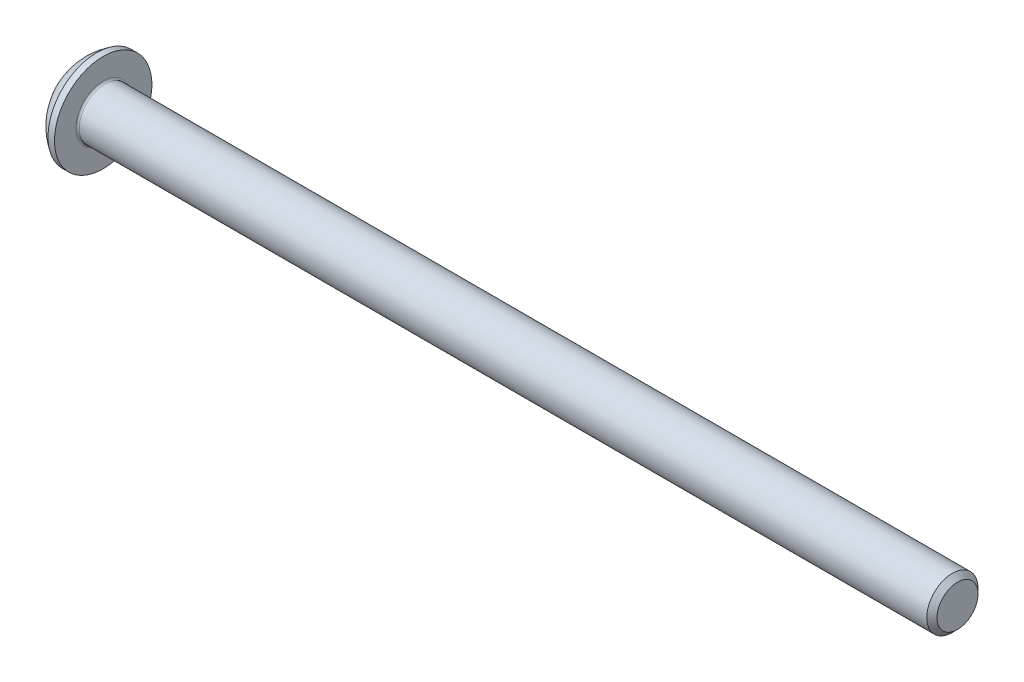
ISO-10303-21;
HEADER;
FILE_DESCRIPTION(('STEP AP214'),'2;1');
FILE_NAME('part.step','',(''),(''),'','','');
FILE_SCHEMA(('AUTOMOTIVE_DESIGN { 1 0 10303 214 1 1 1 1 }'));
ENDSEC;
DATA;
#1=APPLICATION_CONTEXT('core data for automotive mechanical design processes');
#2=APPLICATION_PROTOCOL_DEFINITION('international standard','automotive_design',2000,#1);
#3=PRODUCT_CONTEXT('',#1,'mechanical');
#4=PRODUCT('Part','Part','',(#3));
#5=PRODUCT_RELATED_PRODUCT_CATEGORY('part','',(#4));
#6=PRODUCT_DEFINITION_FORMATION('','',#4);
#7=PRODUCT_DEFINITION_CONTEXT('part definition',#1,'design');
#8=PRODUCT_DEFINITION('design','',#6,#7);
#9=PRODUCT_DEFINITION_SHAPE('','',#8);
#10=(LENGTH_UNIT() NAMED_UNIT(*) SI_UNIT(.MILLI.,.METRE.));
#11=(NAMED_UNIT(*) PLANE_ANGLE_UNIT() SI_UNIT($,.RADIAN.));
#12=(NAMED_UNIT(*) SI_UNIT($,.STERADIAN.) SOLID_ANGLE_UNIT());
#13=UNCERTAINTY_MEASURE_WITH_UNIT(LENGTH_MEASURE(1.E-05),#10,'distance_accuracy_value','');
#14=(GEOMETRIC_REPRESENTATION_CONTEXT(3) GLOBAL_UNCERTAINTY_ASSIGNED_CONTEXT((#13)) GLOBAL_UNIT_ASSIGNED_CONTEXT((#10,
#11,#12)) REPRESENTATION_CONTEXT('',''));
#15=CARTESIAN_POINT('',(0.,0.,0.));
#16=DIRECTION('',(0.,0.,1.));
#17=DIRECTION('',(1.,0.,0.));
#18=AXIS2_PLACEMENT_3D('',#15,#16,#17);
#19=CARTESIAN_POINT('',(0.,0.,0.));
#20=DIRECTION('',(-1.,0.,0.));
#21=DIRECTION('',(0.,0.,1.));
#22=AXIS2_PLACEMENT_3D('',#19,#20,#21);
#23=PLANE('',#22);
#24=CARTESIAN_POINT('',(0.,0.,0.));
#25=DIRECTION('',(-1.,0.,0.));
#26=DIRECTION('',(0.,0.,1.));
#27=AXIS2_PLACEMENT_3D('',#24,#25,#26);
#28=CIRCLE('',#27,1.425);
#29=CARTESIAN_POINT('',(0.,1.42499999999992,0.));
#30=VERTEX_POINT('',#29);
#31=EDGE_CURVE('E163',#30,#30,#28,.T.);
#32=ORIENTED_EDGE('',*,*,#31,.T.);
#33=EDGE_LOOP('',(#32));
#34=FACE_BOUND('',#33,.T.);
#35=DIRECTION('',(0.,-1.,0.));
#36=VECTOR('',#35,1.);
#37=CARTESIAN_POINT('',(-2.22044604925031E-13,-0.577350269189647,1.));
#38=LINE('',#37,#36);
#39=CARTESIAN_POINT('',(0.,0.577350269189647,1.));
#40=VERTEX_POINT('',#39);
#41=CARTESIAN_POINT('',(-2.22044604925031E-13,-0.577350269189647,1.));
#42=VERTEX_POINT('',#41);
#43=EDGE_CURVE('E64',#40,#42,#38,.T.);
#44=ORIENTED_EDGE('',*,*,#43,.T.);
#45=DIRECTION('',(0.,-0.5,-0.866025403784439));
#46=VECTOR('',#45,1.);
#47=CARTESIAN_POINT('',(-2.22044604925031E-13,-1.15470053837924,0.));
#48=LINE('',#47,#46);
#49=CARTESIAN_POINT('',(-2.22044604925031E-13,-1.15470053837924,0.));
#50=VERTEX_POINT('',#49);
#51=EDGE_CURVE('E304',#42,#50,#48,.T.);
#52=ORIENTED_EDGE('',*,*,#51,.T.);
#53=DIRECTION('',(0.,0.5,-0.86602540378444));
#54=VECTOR('',#53,1.);
#55=CARTESIAN_POINT('',(-2.22044604925031E-13,-0.577350269189647,-1.));
#56=LINE('',#55,#54);
#57=CARTESIAN_POINT('',(-2.22044604925031E-13,-0.577350269189647,-1.));
#58=VERTEX_POINT('',#57);
#59=EDGE_CURVE('E144',#50,#58,#56,.T.);
#60=ORIENTED_EDGE('',*,*,#59,.T.);
#61=DIRECTION('',(0.,1.,0.));
#62=VECTOR('',#61,1.);
#63=CARTESIAN_POINT('',(0.,0.577350269189647,-1.));
#64=LINE('',#63,#62);
#65=CARTESIAN_POINT('',(0.,0.577350269189647,-1.));
#66=VERTEX_POINT('',#65);
#67=EDGE_CURVE('E307',#58,#66,#64,.T.);
#68=ORIENTED_EDGE('',*,*,#67,.T.);
#69=DIRECTION('',(0.,0.5,0.866025403784439));
#70=VECTOR('',#69,1.);
#71=CARTESIAN_POINT('',(0.,1.15470053837924,0.));
#72=LINE('',#71,#70);
#73=CARTESIAN_POINT('',(0.,1.15470053837924,0.));
#74=VERTEX_POINT('',#73);
#75=EDGE_CURVE('E309',#66,#74,#72,.T.);
#76=ORIENTED_EDGE('',*,*,#75,.T.);
#77=DIRECTION('',(0.,-0.5,0.86602540378444));
#78=VECTOR('',#77,1.);
#79=CARTESIAN_POINT('',(0.,0.577350269189647,1.));
#80=LINE('',#79,#78);
#81=EDGE_CURVE('E311',#74,#40,#80,.T.);
#82=ORIENTED_EDGE('',*,*,#81,.T.);
#83=EDGE_LOOP('',(#44,#52,#60,#68,#76,#82));
#84=FACE_BOUND('',#83,.T.);
#85=ADVANCED_FACE('F48',(#34,#84),#23,.T.);
#86=CARTESIAN_POINT('',(3.03337598425202,0.,0.));
#87=DIRECTION('',(-1.,0.,0.));
#88=DIRECTION('',(0.,1.,0.));
#89=AXIS2_PLACEMENT_3D('',#86,#87,#88);
#90=SPHERICAL_SURFACE('',#89,3.35141684393879);
#91=CARTESIAN_POINT('',(1.26999999999999,0.,0.));
#92=DIRECTION('',(-1.,0.,0.));
#93=DIRECTION('',(0.,0.,1.));
#94=AXIS2_PLACEMENT_3D('',#91,#92,#93);
#95=CIRCLE('',#94,2.85);
#96=CARTESIAN_POINT('',(1.26999999999999,2.84999999999998,0.));
#97=VERTEX_POINT('',#96);
#98=EDGE_CURVE('E160',#97,#97,#95,.T.);
#99=CARTESIAN_POINT('',(1.26999999999999,2.84999999999998,0.));
#100=CARTESIAN_POINT('',(1.25285414546319,2.83939139761414,0.));
#101=CARTESIAN_POINT('',(1.23580404703094,2.82862803375335,0.));
#102=CARTESIAN_POINT('',(1.20190086550356,2.80679536763412,0.));
#103=CARTESIAN_POINT('',(1.18504778240844,2.79572606537569,0.));
#104=CARTESIAN_POINT('',(1.15154413468335,2.77328510701343,0.));
#105=CARTESIAN_POINT('',(1.13489357005339,2.76191345090961,0.));
#106=CARTESIAN_POINT('',(1.10180037922481,2.73887149459685,0.));
#107=CARTESIAN_POINT('',(1.08535775302621,2.72720119438792,0.));
#108=CARTESIAN_POINT('',(1.0526857959021,2.70356574972794,0.));
#109=CARTESIAN_POINT('',(1.0364564649766,2.69160060527691,0.));
#110=CARTESIAN_POINT('',(1.00421638452907,2.66737936995271,0.));
#111=CARTESIAN_POINT('',(0.988205635007033,2.65512327907954,0.));
#112=CARTESIAN_POINT('',(0.95640793262892,2.63032414298753,0.));
#113=CARTESIAN_POINT('',(0.940620979772841,2.61778109776868,0.));
#114=CARTESIAN_POINT('',(0.909276013003047,2.59241213866924,0.));
#115=CARTESIAN_POINT('',(0.893717999089331,2.57958622478865,0.));
#116=CARTESIAN_POINT('',(0.862835977931979,2.55365570615178,0.));
#117=CARTESIAN_POINT('',(0.847511970688343,2.5405511013955,0.));
#118=CARTESIAN_POINT('',(0.817102954369349,2.51406746958137,0.));
#119=CARTESIAN_POINT('',(0.80201794529399,2.50068844252351,0.));
#120=CARTESIAN_POINT('',(0.772091838962415,2.47366032406547,0.));
#121=CARTESIAN_POINT('',(0.757250741706197,2.46001123266528,0.));
#122=CARTESIAN_POINT('',(0.727817293213742,2.43244743145075,0.));
#123=CARTESIAN_POINT('',(0.713224941977505,2.41853272163641,0.));
#124=CARTESIAN_POINT('',(0.684293738701759,2.39044221604165,0.));
#125=CARTESIAN_POINT('',(0.669954886662251,2.37626642026124,0.));
#126=CARTESIAN_POINT('',(0.641535352384207,2.34765836022615,0.));
#127=CARTESIAN_POINT('',(0.627454670145672,2.33322609597149,0.));
#128=CARTESIAN_POINT('',(0.599556061980001,2.30410980001939,0.));
#129=CARTESIAN_POINT('',(0.585738136052865,2.28942576832196,0.));
#130=CARTESIAN_POINT('',(0.558369541432619,2.25981072052418,0.));
#131=CARTESIAN_POINT('',(0.544818872739509,2.24487970442384,0.));
#132=CARTESIAN_POINT('',(0.517989206456058,2.21477555131052,0.));
#133=CARTESIAN_POINT('',(0.504710208865716,2.19960241429754,0.));
#134=CARTESIAN_POINT('',(0.478428210164926,2.16901896171541,0.));
#135=CARTESIAN_POINT('',(0.465425209054478,2.15360864614626,0.));
#136=CARTESIAN_POINT('',(0.439699438790075,2.12255585606461,0.));
#137=CARTESIAN_POINT('',(0.426976669636121,2.10691338155211,0.));
#138=CARTESIAN_POINT('',(0.401815507481152,2.07540136881786,0.));
#139=CARTESIAN_POINT('',(0.389377114480138,2.05953183059612,0.));
#140=CARTESIAN_POINT('',(0.364788756197469,2.02757085963911,0.));
#141=CARTESIAN_POINT('',(0.352638790915814,2.01147942690385,0.));
#142=CARTESIAN_POINT('',(0.328631245688466,1.9790799083934,0.));
#143=CARTESIAN_POINT('',(0.316773665742772,1.96277182261821,0.));
#144=CARTESIAN_POINT('',(0.293354753565274,1.92994431007198,0.));
#145=CARTESIAN_POINT('',(0.281793421333469,1.91342488330092,0.));
#146=CARTESIAN_POINT('',(0.258970770463944,1.88018006964762,0.));
#147=CARTESIAN_POINT('',(0.247709451826223,1.86345468276536,0.));
#148=CARTESIAN_POINT('',(0.225490496304249,1.82980339686047,0.));
#149=CARTESIAN_POINT('',(0.214532859419997,1.81287749783783,0.));
#150=CARTESIAN_POINT('',(0.19292483663533,1.77883070094112,0.));
#151=CARTESIAN_POINT('',(0.182274450734915,1.76170980306705,0.));
#152=CARTESIAN_POINT('',(0.161284399106577,1.72727858525418,0.));
#153=CARTESIAN_POINT('',(0.150944733378653,1.70996826531539,0.));
#154=CARTESIAN_POINT('',(0.130579489925955,1.67516384193263,0.));
#155=CARTESIAN_POINT('',(0.12055391220118,1.65766973848867,0.));
#156=CARTESIAN_POINT('',(0.100820110825563,1.62250344624935,0.));
#157=CARTESIAN_POINT('',(0.0911118871747207,1.60483125745398,0.));
#158=CARTESIAN_POINT('',(0.0720159545997661,1.5693145516801,0.));
#159=CARTESIAN_POINT('',(0.0626282456756536,1.55147003470159,0.));
#160=CARTESIAN_POINT('',(0.0441764064413357,1.51561448210546,0.));
#161=CARTESIAN_POINT('',(0.0351122761311302,1.49760344648783,0.));
#162=CARTESIAN_POINT('',(0.0173105241148806,1.46142073441834,0.));
#163=CARTESIAN_POINT('',(0.00857290240883637,1.44324905796647,0.));
#164=CARTESIAN_POINT('',(0.,1.42499999999992,0.));
#165=B_SPLINE_CURVE_WITH_KNOTS('',3,(#99,#100,#101,#102,#103,#104,#105,#106,#107,#108,#109,#110,
#111,#112,#113,#114,#115,#116,#117,#118,#119,#120,#121,#122,#123,#124,#125,#126,#127,#128,#129,
#130,#131,#132,#133,#134,#135,#136,#137,#138,#139,#140,#141,#142,#143,#144,#145,#146,#147,#148,
#149,#150,#151,#152,#153,#154,#155,#156,#157,#158,#159,#160,#161,#162,#163,#164),.UNSPECIFIED.,
.F.,.F.,(4,2,2,2,2,2,2,2,2,2,2,2,2,2,2,2,2,2,2,2,2,2,2,2,2,2,2,2,2,2,2,2,4),(0.,
0.0604864075803992,0.120972815160798,0.181459222741197,0.241945630321595,0.302432037901994,
0.362918445482393,0.423404853062792,0.483891260643191,0.54437766822359,0.604864075803989,
0.665350483384388,0.725836890964787,0.786323298545186,0.846809706125584,0.907296113705984,
0.967782521286382,1.02826892886678,1.08875533644718,1.14924174402758,1.20972815160798,
1.27021455918838,1.33070096676878,1.39118737434917,1.45167378192957,1.51216018950997,
1.57264659709037,1.63313300467077,1.69361941225117,1.75410581983157,1.81459222741197,
1.87507863499237,1.93556504257276),.UNSPECIFIED.);
#166=EDGE_CURVE('BSEAM185',#97,#30,#165,.T.);
#167=ORIENTED_EDGE('',*,*,#98,.T.);
#168=ORIENTED_EDGE('',*,*,#31,.F.);
#169=ORIENTED_EDGE('',*,*,#166,.T.);
#170=ORIENTED_EDGE('',*,*,#166,.F.);
#171=EDGE_LOOP('',(#167,#169,#168,#170));
#172=FACE_BOUND('',#171,.T.);
#173=ADVANCED_FACE('F185',(#172),#90,.T.);
#174=CARTESIAN_POINT('',(0.,0.,0.));
#175=DIRECTION('',(-1.,0.,0.));
#176=DIRECTION('',(0.,0.,1.));
#177=AXIS2_PLACEMENT_3D('',#174,#175,#176);
#178=CYLINDRICAL_SURFACE('',#177,2.85);
#179=ORIENTED_EDGE('',*,*,#98,.F.);
#180=EDGE_LOOP('',(#179));
#181=FACE_BOUND('',#180,.T.);
#182=CARTESIAN_POINT('',(1.65000000000004,0.,0.));
#183=DIRECTION('',(-1.,0.,0.));
#184=DIRECTION('',(0.,0.,1.));
#185=AXIS2_PLACEMENT_3D('',#182,#183,#184);
#186=CIRCLE('',#185,2.85);
#187=CARTESIAN_POINT('',(1.65000000000004,0.,2.85));
#188=VERTEX_POINT('',#187);
#189=EDGE_CURVE('E156',#188,#188,#186,.T.);
#190=ORIENTED_EDGE('',*,*,#189,.T.);
#191=EDGE_LOOP('',(#190));
#192=FACE_BOUND('',#191,.T.);
#193=ADVANCED_FACE('F193',(#181,#192),#178,.T.);
#194=CARTESIAN_POINT('',(1.65000000000004,1.5,0.));
#195=DIRECTION('',(-1.,0.,0.));
#196=DIRECTION('',(0.,0.,1.));
#197=AXIS2_PLACEMENT_3D('',#194,#195,#196);
#198=PLANE('',#197);
#199=CARTESIAN_POINT('',(1.65000000000004,0.,0.));
#200=DIRECTION('',(-1.,0.,0.));
#201=DIRECTION('',(0.,0.,1.));
#202=AXIS2_PLACEMENT_3D('',#199,#200,#201);
#203=CIRCLE('',#202,1.6);
#204=CARTESIAN_POINT('',(1.65000000000004,0.,1.6));
#205=VERTEX_POINT('',#204);
#206=EDGE_CURVE('E166',#205,#205,#203,.T.);
#207=ORIENTED_EDGE('',*,*,#206,.T.);
#208=EDGE_LOOP('',(#207));
#209=FACE_BOUND('',#208,.T.);
#210=ORIENTED_EDGE('',*,*,#189,.F.);
#211=EDGE_LOOP('',(#210));
#212=FACE_BOUND('',#211,.T.);
#213=ADVANCED_FACE('F206',(#209,#212),#198,.F.);
#214=CARTESIAN_POINT('',(0.,0.,0.));
#215=DIRECTION('',(-1.,0.,0.));
#216=DIRECTION('',(0.,0.,1.));
#217=AXIS2_PLACEMENT_3D('',#214,#215,#216);
#218=CYLINDRICAL_SURFACE('',#217,1.5);
#219=CARTESIAN_POINT('',(51.35,0.,0.));
#220=DIRECTION('',(1.,0.,0.));
#221=DIRECTION('',(0.,0.,-1.));
#222=AXIS2_PLACEMENT_3D('',#219,#220,#221);
#223=CIRCLE('',#222,1.5);
#224=CARTESIAN_POINT('',(51.35,0.,-1.5));
#225=VERTEX_POINT('',#224);
#226=EDGE_CURVE('E13',#225,#225,#223,.F.);
#227=ORIENTED_EDGE('',*,*,#226,.T.);
#228=EDGE_LOOP('',(#227));
#229=FACE_BOUND('',#228,.T.);
#230=CARTESIAN_POINT('',(1.75000000000003,0.,0.));
#231=DIRECTION('',(-1.,0.,0.));
#232=DIRECTION('',(0.,0.,1.));
#233=AXIS2_PLACEMENT_3D('',#230,#231,#232);
#234=CIRCLE('',#233,1.5);
#235=CARTESIAN_POINT('',(1.75000000000003,0.,1.5));
#236=VERTEX_POINT('',#235);
#237=EDGE_CURVE('E169',#236,#236,#234,.F.);
#238=ORIENTED_EDGE('',*,*,#237,.T.);
#239=EDGE_LOOP('',(#238));
#240=FACE_BOUND('',#239,.T.);
#241=ADVANCED_FACE('F199',(#229,#240),#218,.T.);
#242=CARTESIAN_POINT('',(1.75000000000003,0.,0.));
#243=DIRECTION('',(-1.,0.,0.));
#244=DIRECTION('',(0.,0.,1.));
#245=AXIS2_PLACEMENT_3D('',#242,#243,#244);
#246=TOROIDAL_SURFACE('',#245,1.6,0.1);
#247=ORIENTED_EDGE('',*,*,#237,.F.);
#248=EDGE_LOOP('',(#247));
#249=FACE_BOUND('',#248,.T.);
#250=ORIENTED_EDGE('',*,*,#206,.F.);
#251=EDGE_LOOP('',(#250));
#252=FACE_BOUND('',#251,.T.);
#253=ADVANCED_FACE('F197',(#249,#252),#246,.F.);
#254=CARTESIAN_POINT('',(1.03999999999982,-1.15470053837924,0.));
#255=DIRECTION('',(0.,0.866025403784439,-0.5));
#256=DIRECTION('',(0.,0.5,0.86602540378444));
#257=AXIS2_PLACEMENT_3D('',#254,#255,#256);
#258=PLANE('',#257);
#259=DIRECTION('',(0.,-0.5,-0.866025403784439));
#260=VECTOR('',#259,1.);
#261=CARTESIAN_POINT('',(1.03999999999982,-1.15470053837924,0.));
#262=LINE('',#261,#260);
#263=CARTESIAN_POINT('',(1.03999999999982,-0.577350269189647,1.));
#264=VERTEX_POINT('',#263);
#265=CARTESIAN_POINT('',(1.03999999999982,-0.866025403784443,0.5));
#266=VERTEX_POINT('',#265);
#267=EDGE_CURVE('E130',#264,#266,#262,.T.);
#268=ORIENTED_EDGE('',*,*,#267,.T.);
#269=CARTESIAN_POINT('',(1.03999999999982,-1.15470053837924,0.));
#270=VERTEX_POINT('',#269);
#271=EDGE_CURVE('E125',#266,#270,#262,.T.);
#272=ORIENTED_EDGE('',*,*,#271,.T.);
#273=DIRECTION('',(-1.,0.,0.));
#274=VECTOR('',#273,1.);
#275=CARTESIAN_POINT('',(1.03999999999982,-1.15470053837924,0.));
#276=LINE('',#275,#274);
#277=EDGE_CURVE('E127',#270,#50,#276,.T.);
#278=ORIENTED_EDGE('',*,*,#277,.T.);
#279=ORIENTED_EDGE('',*,*,#51,.F.);
#280=DIRECTION('',(-1.,0.,0.));
#281=VECTOR('',#280,1.);
#282=CARTESIAN_POINT('',(1.03999999999982,-0.577350269189647,1.));
#283=LINE('',#282,#281);
#284=EDGE_CURVE('E300',#264,#42,#283,.T.);
#285=ORIENTED_EDGE('',*,*,#284,.F.);
#286=EDGE_LOOP('',(#268,#272,#278,#279,#285));
#287=FACE_BOUND('',#286,.T.);
#288=ADVANCED_FACE('F126',(#287),#258,.T.);
#289=CARTESIAN_POINT('',(1.03999999999982,-0.577350269189647,-1.));
#290=DIRECTION('',(0.,0.86602540378444,0.5));
#291=DIRECTION('',(0.,-0.5,0.86602540378444));
#292=AXIS2_PLACEMENT_3D('',#289,#290,#291);
#293=PLANE('',#292);
#294=DIRECTION('',(0.,0.5,-0.86602540378444));
#295=VECTOR('',#294,1.);
#296=CARTESIAN_POINT('',(1.03999999999982,-0.577350269189647,-1.));
#297=LINE('',#296,#295);
#298=CARTESIAN_POINT('',(1.03999999999982,-0.866025403784443,-0.5));
#299=VERTEX_POINT('',#298);
#300=EDGE_CURVE('E72',#270,#299,#297,.T.);
#301=ORIENTED_EDGE('',*,*,#300,.T.);
#302=CARTESIAN_POINT('',(1.03999999999982,-0.577350269189647,-1.));
#303=VERTEX_POINT('',#302);
#304=EDGE_CURVE('E139',#299,#303,#297,.T.);
#305=ORIENTED_EDGE('',*,*,#304,.T.);
#306=DIRECTION('',(-1.,0.,0.));
#307=VECTOR('',#306,1.);
#308=CARTESIAN_POINT('',(1.03999999999982,-0.577350269189647,-1.));
#309=LINE('',#308,#307);
#310=EDGE_CURVE('E146',#303,#58,#309,.T.);
#311=ORIENTED_EDGE('',*,*,#310,.T.);
#312=ORIENTED_EDGE('',*,*,#59,.F.);
#313=ORIENTED_EDGE('',*,*,#277,.F.);
#314=EDGE_LOOP('',(#301,#305,#311,#312,#313));
#315=FACE_BOUND('',#314,.T.);
#316=ADVANCED_FACE('F142',(#315),#293,.T.);
#317=CARTESIAN_POINT('',(1.04000000000004,0.577350269189647,-1.));
#318=DIRECTION('',(0.,0.,1.));
#319=DIRECTION('',(1.,0.,0.));
#320=AXIS2_PLACEMENT_3D('',#317,#318,#319);
#321=PLANE('',#320);
#322=DIRECTION('',(0.,1.,0.));
#323=VECTOR('',#322,1.);
#324=CARTESIAN_POINT('',(1.04000000000004,0.577350269189647,-1.));
#325=LINE('',#324,#323);
#326=CARTESIAN_POINT('',(1.04000000000004,0.,-1.));
#327=VERTEX_POINT('',#326);
#328=EDGE_CURVE('E281',#303,#327,#325,.T.);
#329=ORIENTED_EDGE('',*,*,#328,.T.);
#330=CARTESIAN_POINT('',(1.04000000000004,0.577350269189647,-1.));
#331=VERTEX_POINT('',#330);
#332=EDGE_CURVE('E138',#327,#331,#325,.T.);
#333=ORIENTED_EDGE('',*,*,#332,.T.);
#334=DIRECTION('',(-1.,0.,0.));
#335=VECTOR('',#334,1.);
#336=CARTESIAN_POINT('',(1.04000000000004,0.577350269189647,-1.));
#337=LINE('',#336,#335);
#338=EDGE_CURVE('E151',#331,#66,#337,.T.);
#339=ORIENTED_EDGE('',*,*,#338,.T.);
#340=ORIENTED_EDGE('',*,*,#67,.F.);
#341=ORIENTED_EDGE('',*,*,#310,.F.);
#342=EDGE_LOOP('',(#329,#333,#339,#340,#341));
#343=FACE_BOUND('',#342,.T.);
#344=ADVANCED_FACE('F231',(#343),#321,.T.);
#345=CARTESIAN_POINT('',(1.04000000000004,1.15470053837924,0.));
#346=DIRECTION('',(0.,-0.86602540378444,0.5));
#347=DIRECTION('',(0.,-0.5,-0.866025403784439));
#348=AXIS2_PLACEMENT_3D('',#345,#346,#347);
#349=PLANE('',#348);
#350=DIRECTION('',(0.,0.5,0.866025403784439));
#351=VECTOR('',#350,1.);
#352=CARTESIAN_POINT('',(1.04000000000004,1.15470053837924,0.));
#353=LINE('',#352,#351);
#354=CARTESIAN_POINT('',(1.04000000000004,0.866025403784443,-0.5));
#355=VERTEX_POINT('',#354);
#356=EDGE_CURVE('E270',#331,#355,#353,.T.);
#357=ORIENTED_EDGE('',*,*,#356,.T.);
#358=CARTESIAN_POINT('',(1.04000000000004,1.15470053837924,0.));
#359=VERTEX_POINT('',#358);
#360=EDGE_CURVE('E275',#355,#359,#353,.T.);
#361=ORIENTED_EDGE('',*,*,#360,.T.);
#362=DIRECTION('',(-1.,0.,0.));
#363=VECTOR('',#362,1.);
#364=CARTESIAN_POINT('',(1.04000000000004,1.15470053837924,0.));
#365=LINE('',#364,#363);
#366=EDGE_CURVE('E315',#359,#74,#365,.T.);
#367=ORIENTED_EDGE('',*,*,#366,.T.);
#368=ORIENTED_EDGE('',*,*,#75,.F.);
#369=ORIENTED_EDGE('',*,*,#338,.F.);
#370=EDGE_LOOP('',(#357,#361,#367,#368,#369));
#371=FACE_BOUND('',#370,.T.);
#372=ADVANCED_FACE('F234',(#371),#349,.T.);
#373=CARTESIAN_POINT('',(1.04000000000004,0.577350269189647,1.));
#374=DIRECTION('',(0.,-0.86602540378444,-0.5));
#375=DIRECTION('',(0.,0.5,-0.86602540378444));
#376=AXIS2_PLACEMENT_3D('',#373,#374,#375);
#377=PLANE('',#376);
#378=DIRECTION('',(0.,-0.5,0.86602540378444));
#379=VECTOR('',#378,1.);
#380=CARTESIAN_POINT('',(1.04000000000004,0.577350269189647,1.));
#381=LINE('',#380,#379);
#382=CARTESIAN_POINT('',(1.04000000000004,0.866025403784443,0.5));
#383=VERTEX_POINT('',#382);
#384=EDGE_CURVE('E278',#359,#383,#381,.T.);
#385=ORIENTED_EDGE('',*,*,#384,.T.);
#386=CARTESIAN_POINT('',(1.04000000000004,0.577350269189647,1.));
#387=VERTEX_POINT('',#386);
#388=EDGE_CURVE('E286',#383,#387,#381,.T.);
#389=ORIENTED_EDGE('',*,*,#388,.T.);
#390=DIRECTION('',(-1.,0.,0.));
#391=VECTOR('',#390,1.);
#392=CARTESIAN_POINT('',(1.04000000000004,0.577350269189647,1.));
#393=LINE('',#392,#391);
#394=EDGE_CURVE('E299',#387,#40,#393,.T.);
#395=ORIENTED_EDGE('',*,*,#394,.T.);
#396=ORIENTED_EDGE('',*,*,#81,.F.);
#397=ORIENTED_EDGE('',*,*,#366,.F.);
#398=EDGE_LOOP('',(#385,#389,#395,#396,#397));
#399=FACE_BOUND('',#398,.T.);
#400=ADVANCED_FACE('F238',(#399),#377,.T.);
#401=CARTESIAN_POINT('',(1.03999999999982,-0.577350269189647,1.));
#402=DIRECTION('',(0.,0.,-1.));
#403=DIRECTION('',(0.,1.,0.));
#404=AXIS2_PLACEMENT_3D('',#401,#402,#403);
#405=PLANE('',#404);
#406=DIRECTION('',(0.,-1.,0.));
#407=VECTOR('',#406,1.);
#408=CARTESIAN_POINT('',(1.03999999999982,-0.577350269189647,1.));
#409=LINE('',#408,#407);
#410=CARTESIAN_POINT('',(1.04000000000004,0.,1.));
#411=VERTEX_POINT('',#410);
#412=EDGE_CURVE('E292',#387,#411,#409,.T.);
#413=ORIENTED_EDGE('',*,*,#412,.T.);
#414=EDGE_CURVE('E294',#411,#264,#409,.T.);
#415=ORIENTED_EDGE('',*,*,#414,.T.);
#416=ORIENTED_EDGE('',*,*,#284,.T.);
#417=ORIENTED_EDGE('',*,*,#43,.F.);
#418=ORIENTED_EDGE('',*,*,#394,.F.);
#419=EDGE_LOOP('',(#413,#415,#416,#417,#418));
#420=FACE_BOUND('',#419,.T.);
#421=ADVANCED_FACE('F242',(#420),#405,.T.);
#422=CARTESIAN_POINT('',(1.03999999999982,-1.73205080756889,-1.));
#423=DIRECTION('',(1.,0.,0.));
#424=DIRECTION('',(0.,0.,-1.));
#425=AXIS2_PLACEMENT_3D('',#422,#423,#424);
#426=PLANE('',#425);
#427=CARTESIAN_POINT('',(1.04000000000004,0.,0.));
#428=DIRECTION('',(-1.,0.,0.));
#429=DIRECTION('',(0.,0.,1.));
#430=AXIS2_PLACEMENT_3D('',#427,#428,#429);
#431=CIRCLE('',#430,1.);
#432=EDGE_CURVE('E267',#355,#327,#431,.T.);
#433=ORIENTED_EDGE('',*,*,#432,.F.);
#434=ORIENTED_EDGE('',*,*,#356,.F.);
#435=ORIENTED_EDGE('',*,*,#332,.F.);
#436=EDGE_LOOP('',(#433,#434,#435));
#437=FACE_BOUND('',#436,.T.);
#438=ADVANCED_FACE('F246',(#437),#426,.F.);
#439=EDGE_CURVE('E157',#383,#355,#431,.T.);
#440=ORIENTED_EDGE('',*,*,#439,.F.);
#441=ORIENTED_EDGE('',*,*,#384,.F.);
#442=ORIENTED_EDGE('',*,*,#360,.F.);
#443=EDGE_LOOP('',(#440,#441,#442));
#444=FACE_BOUND('',#443,.T.);
#445=ADVANCED_FACE('F256',(#444),#426,.F.);
#446=EDGE_CURVE('E150',#411,#383,#431,.T.);
#447=ORIENTED_EDGE('',*,*,#446,.F.);
#448=ORIENTED_EDGE('',*,*,#412,.F.);
#449=ORIENTED_EDGE('',*,*,#388,.F.);
#450=EDGE_LOOP('',(#447,#448,#449));
#451=FACE_BOUND('',#450,.T.);
#452=ADVANCED_FACE('F262',(#451),#426,.F.);
#453=EDGE_CURVE('E145',#266,#411,#431,.T.);
#454=ORIENTED_EDGE('',*,*,#453,.F.);
#455=ORIENTED_EDGE('',*,*,#267,.F.);
#456=ORIENTED_EDGE('',*,*,#414,.F.);
#457=EDGE_LOOP('',(#454,#455,#456));
#458=FACE_BOUND('',#457,.T.);
#459=ADVANCED_FACE('F254',(#458),#426,.F.);
#460=EDGE_CURVE('E136',#299,#266,#431,.T.);
#461=ORIENTED_EDGE('',*,*,#460,.F.);
#462=ORIENTED_EDGE('',*,*,#300,.F.);
#463=ORIENTED_EDGE('',*,*,#271,.F.);
#464=EDGE_LOOP('',(#461,#462,#463));
#465=FACE_BOUND('',#464,.T.);
#466=ADVANCED_FACE('F135',(#465),#426,.F.);
#467=EDGE_CURVE('E273',#327,#299,#431,.T.);
#468=ORIENTED_EDGE('',*,*,#467,.F.);
#469=ORIENTED_EDGE('',*,*,#328,.F.);
#470=ORIENTED_EDGE('',*,*,#304,.F.);
#471=EDGE_LOOP('',(#468,#469,#470));
#472=FACE_BOUND('',#471,.T.);
#473=ADVANCED_FACE('F226',(#472),#426,.F.);
#474=CARTESIAN_POINT('',(1.61735026918963,0.,0.));
#475=DIRECTION('',(-1.,0.,0.));
#476=DIRECTION('',(0.,0.,1.));
#477=AXIS2_PLACEMENT_3D('',#474,#475,#476);
#478=CONICAL_SURFACE('',#477,0.,1.0471975511966);
#479=ORIENTED_EDGE('',*,*,#446,.T.);
#480=ORIENTED_EDGE('',*,*,#439,.T.);
#481=ORIENTED_EDGE('',*,*,#432,.T.);
#482=ORIENTED_EDGE('',*,*,#467,.T.);
#483=ORIENTED_EDGE('',*,*,#460,.T.);
#484=ORIENTED_EDGE('',*,*,#453,.T.);
#485=EDGE_LOOP('',(#479,#480,#481,#482,#483,#484));
#486=FACE_BOUND('',#485,.T.);
#487=CARTESIAN_POINT('',(1.61735026918963,0.,0.));
#488=VERTEX_POINT('',#487);
#489=VERTEX_LOOP('',#488);
#490=FACE_BOUND('',#489,.T.);
#491=ADVANCED_FACE('F181',(#486,#490),#478,.F.);
#492=CARTESIAN_POINT('',(51.65,0.,0.));
#493=DIRECTION('',(1.,0.,0.));
#494=DIRECTION('',(0.,0.,-1.));
#495=AXIS2_PLACEMENT_3D('',#492,#493,#494);
#496=PLANE('',#495);
#497=CARTESIAN_POINT('',(51.65,0.,0.));
#498=DIRECTION('',(1.,0.,0.));
#499=DIRECTION('',(0.,0.,-1.));
#500=AXIS2_PLACEMENT_3D('',#497,#498,#499);
#501=CIRCLE('',#500,1.19999999999999);
#502=CARTESIAN_POINT('',(51.65,0.,-1.19999999999999));
#503=VERTEX_POINT('',#502);
#504=EDGE_CURVE('E57',#503,#503,#501,.T.);
#505=ORIENTED_EDGE('',*,*,#504,.T.);
#506=EDGE_LOOP('',(#505));
#507=FACE_BOUND('',#506,.T.);
#508=ADVANCED_FACE('F174',(#507),#496,.T.);
#509=CARTESIAN_POINT('',(51.65,0.,0.));
#510=DIRECTION('',(-1.,0.,0.));
#511=DIRECTION('',(0.,0.,1.));
#512=AXIS2_PLACEMENT_3D('',#509,#510,#511);
#513=CONICAL_SURFACE('',#512,1.19999999999999,0.785398163397446);
#514=ORIENTED_EDGE('',*,*,#226,.F.);
#515=EDGE_LOOP('',(#514));
#516=FACE_BOUND('',#515,.T.);
#517=ORIENTED_EDGE('',*,*,#504,.F.);
#518=EDGE_LOOP('',(#517));
#519=FACE_BOUND('',#518,.T.);
#520=ADVANCED_FACE('F51',(#516,#519),#513,.T.);
#521=CLOSED_SHELL('',(#85,#173,#193,#213,#241,#253,#288,#316,#344,#372,#400,#421,#438,#445,#452,
#459,#466,#473,#491,#508,#520));
#522=MANIFOLD_SOLID_BREP('B2',#521);
#523=ADVANCED_BREP_SHAPE_REPRESENTATION('',(#18,#522),#14);
#524=SHAPE_DEFINITION_REPRESENTATION(#9,#523);
ENDSEC;
END-ISO-10303-21;
